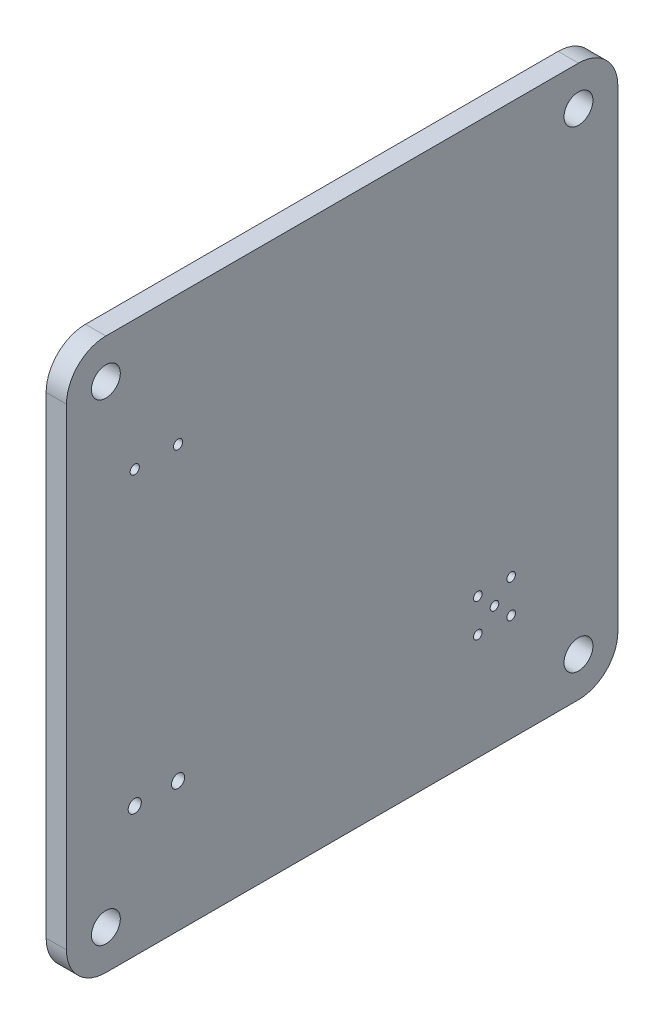
ISO-10303-21;
HEADER;
FILE_DESCRIPTION(('STEP AP214'),'2;1');
FILE_NAME('part.step','',(''),(''),'','','');
FILE_SCHEMA(('AUTOMOTIVE_DESIGN { 1 0 10303 214 1 1 1 1 }'));
ENDSEC;
DATA;
#1=APPLICATION_CONTEXT('core data for automotive mechanical design processes');
#2=APPLICATION_PROTOCOL_DEFINITION('international standard','automotive_design',2000,#1);
#3=PRODUCT_CONTEXT('',#1,'mechanical');
#4=PRODUCT('Part','Part','',(#3));
#5=PRODUCT_RELATED_PRODUCT_CATEGORY('part','',(#4));
#6=PRODUCT_DEFINITION_FORMATION('','',#4);
#7=PRODUCT_DEFINITION_CONTEXT('part definition',#1,'design');
#8=PRODUCT_DEFINITION('design','',#6,#7);
#9=PRODUCT_DEFINITION_SHAPE('','',#8);
#10=(LENGTH_UNIT() NAMED_UNIT(*) SI_UNIT(.MILLI.,.METRE.));
#11=(NAMED_UNIT(*) PLANE_ANGLE_UNIT() SI_UNIT($,.RADIAN.));
#12=(NAMED_UNIT(*) SI_UNIT($,.STERADIAN.) SOLID_ANGLE_UNIT());
#13=UNCERTAINTY_MEASURE_WITH_UNIT(LENGTH_MEASURE(1.E-05),#10,'distance_accuracy_value','');
#14=(GEOMETRIC_REPRESENTATION_CONTEXT(3) GLOBAL_UNCERTAINTY_ASSIGNED_CONTEXT((#13)) GLOBAL_UNIT_ASSIGNED_CONTEXT((#10,
#11,#12)) REPRESENTATION_CONTEXT('',''));
#15=CARTESIAN_POINT('',(0.,0.,0.));
#16=DIRECTION('',(0.,0.,1.));
#17=DIRECTION('',(1.,0.,0.));
#18=AXIS2_PLACEMENT_3D('',#15,#16,#17);
#19=CARTESIAN_POINT('',(0.,21.,21.));
#20=DIRECTION('',(1.,0.,0.));
#21=DIRECTION('',(0.,0.,-1.));
#22=AXIS2_PLACEMENT_3D('',#19,#20,#21);
#23=PLANE('',#22);
#24=CARTESIAN_POINT('',(0.,10.668,8.128));
#25=DIRECTION('',(1.,0.,0.));
#26=DIRECTION('',(0.,0.,-1.));
#27=AXIS2_PLACEMENT_3D('',#24,#25,#26);
#28=CIRCLE('',#27,0.327000000000004);
#29=CARTESIAN_POINT('',(0.,10.668,7.801));
#30=VERTEX_POINT('',#29);
#31=EDGE_CURVE('E165',#30,#30,#28,.T.);
#32=ORIENTED_EDGE('',*,*,#31,.T.);
#33=EDGE_LOOP('',(#32));
#34=FACE_BOUND('',#33,.T.);
#35=CARTESIAN_POINT('',(0.,8.128,8.128));
#36=DIRECTION('',(1.,0.,0.));
#37=DIRECTION('',(0.,0.,-1.));
#38=AXIS2_PLACEMENT_3D('',#35,#36,#37);
#39=CIRCLE('',#38,0.327000000000004);
#40=CARTESIAN_POINT('',(0.,8.128,7.801));
#41=VERTEX_POINT('',#40);
#42=EDGE_CURVE('E168',#41,#41,#39,.T.);
#43=ORIENTED_EDGE('',*,*,#42,.T.);
#44=EDGE_LOOP('',(#43));
#45=FACE_BOUND('',#44,.T.);
#46=CARTESIAN_POINT('',(0.,8.128,10.668));
#47=DIRECTION('',(1.,0.,0.));
#48=DIRECTION('',(0.,0.,-1.));
#49=AXIS2_PLACEMENT_3D('',#46,#47,#48);
#50=CIRCLE('',#49,0.327000000000004);
#51=CARTESIAN_POINT('',(0.,8.128,10.341));
#52=VERTEX_POINT('',#51);
#53=EDGE_CURVE('E171',#52,#52,#50,.T.);
#54=ORIENTED_EDGE('',*,*,#53,.T.);
#55=EDGE_LOOP('',(#54));
#56=FACE_BOUND('',#55,.T.);
#57=CARTESIAN_POINT('',(0.,10.668,10.668));
#58=DIRECTION('',(1.,0.,0.));
#59=DIRECTION('',(0.,0.,-1.));
#60=AXIS2_PLACEMENT_3D('',#57,#58,#59);
#61=CIRCLE('',#60,0.327000000000004);
#62=CARTESIAN_POINT('',(0.,10.668,10.341));
#63=VERTEX_POINT('',#62);
#64=EDGE_CURVE('E174',#63,#63,#61,.T.);
#65=ORIENTED_EDGE('',*,*,#64,.T.);
#66=EDGE_LOOP('',(#65));
#67=FACE_BOUND('',#66,.T.);
#68=CARTESIAN_POINT('',(0.,9.398,9.398));
#69=DIRECTION('',(1.,0.,0.));
#70=DIRECTION('',(0.,0.,-1.));
#71=AXIS2_PLACEMENT_3D('',#68,#69,#70);
#72=CIRCLE('',#71,0.327);
#73=CARTESIAN_POINT('',(0.,9.398,9.071));
#74=VERTEX_POINT('',#73);
#75=EDGE_CURVE('E177',#74,#74,#72,.T.);
#76=ORIENTED_EDGE('',*,*,#75,.T.);
#77=EDGE_LOOP('',(#76));
#78=FACE_BOUND('',#77,.T.);
#79=CARTESIAN_POINT('',(0.,32.1,33.5));
#80=DIRECTION('',(1.,0.,0.));
#81=DIRECTION('',(0.,0.,-1.));
#82=AXIS2_PLACEMENT_3D('',#79,#80,#81);
#83=CIRCLE('',#82,0.35);
#84=CARTESIAN_POINT('',(0.,32.1,33.15));
#85=VERTEX_POINT('',#84);
#86=EDGE_CURVE('E180',#85,#85,#83,.T.);
#87=ORIENTED_EDGE('',*,*,#86,.T.);
#88=EDGE_LOOP('',(#87));
#89=FACE_BOUND('',#88,.T.);
#90=CARTESIAN_POINT('',(0.,32.1,36.8));
#91=DIRECTION('',(1.,0.,0.));
#92=DIRECTION('',(0.,0.,-1.));
#93=AXIS2_PLACEMENT_3D('',#90,#91,#92);
#94=CIRCLE('',#93,0.35);
#95=CARTESIAN_POINT('',(0.,32.1,36.45));
#96=VERTEX_POINT('',#95);
#97=EDGE_CURVE('E183',#96,#96,#94,.T.);
#98=ORIENTED_EDGE('',*,*,#97,.T.);
#99=EDGE_LOOP('',(#98));
#100=FACE_BOUND('',#99,.T.);
#101=CARTESIAN_POINT('',(0.,9.9,33.5));
#102=DIRECTION('',(1.,0.,0.));
#103=DIRECTION('',(0.,0.,-1.));
#104=AXIS2_PLACEMENT_3D('',#101,#102,#103);
#105=CIRCLE('',#104,0.5);
#106=CARTESIAN_POINT('',(0.,9.9,33.));
#107=VERTEX_POINT('',#106);
#108=EDGE_CURVE('E186',#107,#107,#105,.T.);
#109=ORIENTED_EDGE('',*,*,#108,.T.);
#110=EDGE_LOOP('',(#109));
#111=FACE_BOUND('',#110,.T.);
#112=CARTESIAN_POINT('',(0.,9.9,36.8));
#113=DIRECTION('',(1.,0.,0.));
#114=DIRECTION('',(0.,0.,-1.));
#115=AXIS2_PLACEMENT_3D('',#112,#113,#114);
#116=CIRCLE('',#115,0.5);
#117=CARTESIAN_POINT('',(0.,9.9,36.3));
#118=VERTEX_POINT('',#117);
#119=EDGE_CURVE('E189',#118,#118,#116,.T.);
#120=ORIENTED_EDGE('',*,*,#119,.T.);
#121=EDGE_LOOP('',(#120));
#122=FACE_BOUND('',#121,.T.);
#123=CARTESIAN_POINT('',(0.,39.,3.));
#124=DIRECTION('',(1.,0.,0.));
#125=DIRECTION('',(0.,0.,-1.));
#126=AXIS2_PLACEMENT_3D('',#123,#124,#125);
#127=CIRCLE('',#126,1.1);
#128=CARTESIAN_POINT('',(0.,39.,1.9));
#129=VERTEX_POINT('',#128);
#130=EDGE_CURVE('E192',#129,#129,#127,.T.);
#131=ORIENTED_EDGE('',*,*,#130,.T.);
#132=EDGE_LOOP('',(#131));
#133=FACE_BOUND('',#132,.T.);
#134=CARTESIAN_POINT('',(0.,39.,39.));
#135=DIRECTION('',(1.,0.,0.));
#136=DIRECTION('',(0.,0.,-1.));
#137=AXIS2_PLACEMENT_3D('',#134,#135,#136);
#138=CIRCLE('',#137,1.1);
#139=CARTESIAN_POINT('',(0.,39.,37.9));
#140=VERTEX_POINT('',#139);
#141=EDGE_CURVE('E195',#140,#140,#138,.T.);
#142=ORIENTED_EDGE('',*,*,#141,.T.);
#143=EDGE_LOOP('',(#142));
#144=FACE_BOUND('',#143,.T.);
#145=CARTESIAN_POINT('',(0.,3.,3.));
#146=DIRECTION('',(1.,0.,0.));
#147=DIRECTION('',(0.,0.,-1.));
#148=AXIS2_PLACEMENT_3D('',#145,#146,#147);
#149=CIRCLE('',#148,1.1);
#150=CARTESIAN_POINT('',(0.,3.,1.9));
#151=VERTEX_POINT('',#150);
#152=EDGE_CURVE('E198',#151,#151,#149,.T.);
#153=ORIENTED_EDGE('',*,*,#152,.T.);
#154=EDGE_LOOP('',(#153));
#155=FACE_BOUND('',#154,.T.);
#156=CARTESIAN_POINT('',(0.,3.,39.));
#157=DIRECTION('',(1.,0.,0.));
#158=DIRECTION('',(0.,0.,-1.));
#159=AXIS2_PLACEMENT_3D('',#156,#157,#158);
#160=CIRCLE('',#159,1.1);
#161=CARTESIAN_POINT('',(0.,3.,37.9));
#162=VERTEX_POINT('',#161);
#163=EDGE_CURVE('E201',#162,#162,#160,.T.);
#164=ORIENTED_EDGE('',*,*,#163,.T.);
#165=EDGE_LOOP('',(#164));
#166=FACE_BOUND('',#165,.T.);
#167=DIRECTION('',(0.,1.,0.));
#168=VECTOR('',#167,1.);
#169=CARTESIAN_POINT('',(0.,39.,42.));
#170=LINE('',#169,#168);
#171=CARTESIAN_POINT('',(0.,39.,42.));
#172=VERTEX_POINT('',#171);
#173=CARTESIAN_POINT('',(0.,3.,42.));
#174=VERTEX_POINT('',#173);
#175=EDGE_CURVE('E82',#172,#174,#170,.F.);
#176=ORIENTED_EDGE('',*,*,#175,.F.);
#177=CARTESIAN_POINT('',(0.,39.,39.));
#178=DIRECTION('',(1.,0.,0.));
#179=DIRECTION('',(0.,0.,-1.));
#180=AXIS2_PLACEMENT_3D('',#177,#178,#179);
#181=CIRCLE('',#180,3.);
#182=CARTESIAN_POINT('',(0.,42.,39.));
#183=VERTEX_POINT('',#182);
#184=EDGE_CURVE('E99',#183,#172,#181,.T.);
#185=ORIENTED_EDGE('',*,*,#184,.F.);
#186=DIRECTION('',(0.,0.,1.));
#187=VECTOR('',#186,1.);
#188=CARTESIAN_POINT('',(0.,42.,3.));
#189=LINE('',#188,#187);
#190=CARTESIAN_POINT('',(0.,42.,3.));
#191=VERTEX_POINT('',#190);
#192=EDGE_CURVE('E105',#191,#183,#189,.T.);
#193=ORIENTED_EDGE('',*,*,#192,.F.);
#194=CARTESIAN_POINT('',(0.,39.,3.));
#195=DIRECTION('',(1.,0.,0.));
#196=DIRECTION('',(0.,0.,-1.));
#197=AXIS2_PLACEMENT_3D('',#194,#195,#196);
#198=CIRCLE('',#197,3.);
#199=CARTESIAN_POINT('',(0.,39.,0.));
#200=VERTEX_POINT('',#199);
#201=EDGE_CURVE('E205',#200,#191,#198,.T.);
#202=ORIENTED_EDGE('',*,*,#201,.F.);
#203=DIRECTION('',(0.,1.,0.));
#204=VECTOR('',#203,1.);
#205=CARTESIAN_POINT('',(0.,3.,0.));
#206=LINE('',#205,#204);
#207=CARTESIAN_POINT('',(0.,3.,0.));
#208=VERTEX_POINT('',#207);
#209=EDGE_CURVE('E110',#208,#200,#206,.T.);
#210=ORIENTED_EDGE('',*,*,#209,.F.);
#211=CARTESIAN_POINT('',(0.,3.,3.));
#212=DIRECTION('',(1.,0.,0.));
#213=DIRECTION('',(0.,0.,-1.));
#214=AXIS2_PLACEMENT_3D('',#211,#212,#213);
#215=CIRCLE('',#214,3.);
#216=CARTESIAN_POINT('',(0.,0.,3.));
#217=VERTEX_POINT('',#216);
#218=EDGE_CURVE('E207',#217,#208,#215,.T.);
#219=ORIENTED_EDGE('',*,*,#218,.F.);
#220=DIRECTION('',(0.,0.,-1.));
#221=VECTOR('',#220,1.);
#222=CARTESIAN_POINT('',(0.,0.,39.));
#223=LINE('',#222,#221);
#224=CARTESIAN_POINT('',(0.,0.,39.));
#225=VERTEX_POINT('',#224);
#226=EDGE_CURVE('E84',#225,#217,#223,.T.);
#227=ORIENTED_EDGE('',*,*,#226,.F.);
#228=CARTESIAN_POINT('',(0.,3.,39.));
#229=DIRECTION('',(1.,0.,0.));
#230=DIRECTION('',(0.,0.,-1.));
#231=AXIS2_PLACEMENT_3D('',#228,#229,#230);
#232=CIRCLE('',#231,3.);
#233=EDGE_CURVE('E20',#174,#225,#232,.T.);
#234=ORIENTED_EDGE('',*,*,#233,.F.);
#235=EDGE_LOOP('',(#176,#185,#193,#202,#210,#219,#227,#234));
#236=FACE_BOUND('',#235,.T.);
#237=ADVANCED_FACE('F17',(#34,#45,#56,#67,#78,#89,#100,#111,#122,#133,#144,#155,#166,#236),#23,.F.);
#238=CARTESIAN_POINT('',(0.,3.,39.));
#239=DIRECTION('',(1.,0.,0.));
#240=DIRECTION('',(0.,0.,-1.));
#241=AXIS2_PLACEMENT_3D('',#238,#239,#240);
#242=CYLINDRICAL_SURFACE('',#241,3.);
#243=CARTESIAN_POINT('',(1.55,3.,39.));
#244=DIRECTION('',(1.,0.,0.));
#245=DIRECTION('',(0.,0.,-1.));
#246=AXIS2_PLACEMENT_3D('',#243,#244,#245);
#247=CIRCLE('',#246,3.);
#248=CARTESIAN_POINT('',(1.55,3.,42.));
#249=VERTEX_POINT('',#248);
#250=CARTESIAN_POINT('',(1.55,0.,39.));
#251=VERTEX_POINT('',#250);
#252=EDGE_CURVE('E91',#249,#251,#247,.T.);
#253=ORIENTED_EDGE('',*,*,#252,.F.);
#254=DIRECTION('',(1.,0.,0.));
#255=VECTOR('',#254,1.);
#256=CARTESIAN_POINT('',(0.,3.,42.));
#257=LINE('',#256,#255);
#258=EDGE_CURVE('E88',#174,#249,#257,.T.);
#259=ORIENTED_EDGE('',*,*,#258,.F.);
#260=ORIENTED_EDGE('',*,*,#233,.T.);
#261=DIRECTION('',(1.,0.,0.));
#262=VECTOR('',#261,1.);
#263=CARTESIAN_POINT('',(0.,0.,39.));
#264=LINE('',#263,#262);
#265=EDGE_CURVE('E103',#251,#225,#264,.F.);
#266=ORIENTED_EDGE('',*,*,#265,.F.);
#267=EDGE_LOOP('',(#253,#259,#260,#266));
#268=FACE_BOUND('',#267,.T.);
#269=ADVANCED_FACE('F89',(#268),#242,.T.);
#270=CARTESIAN_POINT('',(0.,0.,39.));
#271=DIRECTION('',(0.,-1.,0.));
#272=DIRECTION('',(0.,0.,-1.));
#273=AXIS2_PLACEMENT_3D('',#270,#271,#272);
#274=PLANE('',#273);
#275=DIRECTION('',(0.,0.,-1.));
#276=VECTOR('',#275,1.);
#277=CARTESIAN_POINT('',(1.55,0.,21.));
#278=LINE('',#277,#276);
#279=CARTESIAN_POINT('',(1.55,0.,3.));
#280=VERTEX_POINT('',#279);
#281=EDGE_CURVE('E163',#251,#280,#278,.T.);
#282=ORIENTED_EDGE('',*,*,#281,.F.);
#283=ORIENTED_EDGE('',*,*,#265,.T.);
#284=ORIENTED_EDGE('',*,*,#226,.T.);
#285=DIRECTION('',(1.,0.,0.));
#286=VECTOR('',#285,1.);
#287=CARTESIAN_POINT('',(0.,0.,3.));
#288=LINE('',#287,#286);
#289=EDGE_CURVE('E114',#280,#217,#288,.F.);
#290=ORIENTED_EDGE('',*,*,#289,.F.);
#291=EDGE_LOOP('',(#282,#283,#284,#290));
#292=FACE_BOUND('',#291,.T.);
#293=ADVANCED_FACE('F214',(#292),#274,.T.);
#294=CARTESIAN_POINT('',(0.,3.,3.));
#295=DIRECTION('',(1.,0.,0.));
#296=DIRECTION('',(0.,0.,-1.));
#297=AXIS2_PLACEMENT_3D('',#294,#295,#296);
#298=CYLINDRICAL_SURFACE('',#297,3.);
#299=CARTESIAN_POINT('',(1.55,3.,3.));
#300=DIRECTION('',(1.,0.,0.));
#301=DIRECTION('',(0.,0.,-1.));
#302=AXIS2_PLACEMENT_3D('',#299,#300,#301);
#303=CIRCLE('',#302,3.);
#304=CARTESIAN_POINT('',(1.55,3.,0.));
#305=VERTEX_POINT('',#304);
#306=EDGE_CURVE('E160',#280,#305,#303,.T.);
#307=ORIENTED_EDGE('',*,*,#306,.F.);
#308=ORIENTED_EDGE('',*,*,#289,.T.);
#309=ORIENTED_EDGE('',*,*,#218,.T.);
#310=DIRECTION('',(-1.,0.,0.));
#311=VECTOR('',#310,1.);
#312=CARTESIAN_POINT('',(0.,3.,0.));
#313=LINE('',#312,#311);
#314=EDGE_CURVE('E113',#305,#208,#313,.T.);
#315=ORIENTED_EDGE('',*,*,#314,.F.);
#316=EDGE_LOOP('',(#307,#308,#309,#315));
#317=FACE_BOUND('',#316,.T.);
#318=ADVANCED_FACE('F234',(#317),#298,.T.);
#319=CARTESIAN_POINT('',(0.,3.,0.));
#320=DIRECTION('',(0.,0.,-1.));
#321=DIRECTION('',(-1.,0.,0.));
#322=AXIS2_PLACEMENT_3D('',#319,#320,#321);
#323=PLANE('',#322);
#324=DIRECTION('',(0.,1.,0.));
#325=VECTOR('',#324,1.);
#326=CARTESIAN_POINT('',(1.55,21.,0.));
#327=LINE('',#326,#325);
#328=CARTESIAN_POINT('',(1.55,39.,0.));
#329=VERTEX_POINT('',#328);
#330=EDGE_CURVE('E159',#305,#329,#327,.T.);
#331=ORIENTED_EDGE('',*,*,#330,.F.);
#332=ORIENTED_EDGE('',*,*,#314,.T.);
#333=ORIENTED_EDGE('',*,*,#209,.T.);
#334=DIRECTION('',(1.,0.,0.));
#335=VECTOR('',#334,1.);
#336=CARTESIAN_POINT('',(0.,39.,0.));
#337=LINE('',#336,#335);
#338=EDGE_CURVE('E109',#329,#200,#337,.F.);
#339=ORIENTED_EDGE('',*,*,#338,.F.);
#340=EDGE_LOOP('',(#331,#332,#333,#339));
#341=FACE_BOUND('',#340,.T.);
#342=ADVANCED_FACE('F233',(#341),#323,.T.);
#343=CARTESIAN_POINT('',(0.,39.,3.));
#344=DIRECTION('',(1.,0.,0.));
#345=DIRECTION('',(0.,0.,-1.));
#346=AXIS2_PLACEMENT_3D('',#343,#344,#345);
#347=CYLINDRICAL_SURFACE('',#346,3.);
#348=CARTESIAN_POINT('',(1.55,39.,3.));
#349=DIRECTION('',(1.,0.,0.));
#350=DIRECTION('',(0.,0.,-1.));
#351=AXIS2_PLACEMENT_3D('',#348,#349,#350);
#352=CIRCLE('',#351,3.);
#353=CARTESIAN_POINT('',(1.55,42.,3.));
#354=VERTEX_POINT('',#353);
#355=EDGE_CURVE('E156',#329,#354,#352,.T.);
#356=ORIENTED_EDGE('',*,*,#355,.F.);
#357=ORIENTED_EDGE('',*,*,#338,.T.);
#358=ORIENTED_EDGE('',*,*,#201,.T.);
#359=DIRECTION('',(1.,0.,0.));
#360=VECTOR('',#359,1.);
#361=CARTESIAN_POINT('',(0.,42.,3.));
#362=LINE('',#361,#360);
#363=EDGE_CURVE('E108',#354,#191,#362,.F.);
#364=ORIENTED_EDGE('',*,*,#363,.F.);
#365=EDGE_LOOP('',(#356,#357,#358,#364));
#366=FACE_BOUND('',#365,.T.);
#367=ADVANCED_FACE('F238',(#366),#347,.T.);
#368=CARTESIAN_POINT('',(0.,42.,3.));
#369=DIRECTION('',(0.,1.,0.));
#370=DIRECTION('',(0.,0.,1.));
#371=AXIS2_PLACEMENT_3D('',#368,#369,#370);
#372=PLANE('',#371);
#373=DIRECTION('',(0.,0.,-1.));
#374=VECTOR('',#373,1.);
#375=CARTESIAN_POINT('',(1.55,42.,21.));
#376=LINE('',#375,#374);
#377=CARTESIAN_POINT('',(1.55,42.,39.));
#378=VERTEX_POINT('',#377);
#379=EDGE_CURVE('E155',#354,#378,#376,.F.);
#380=ORIENTED_EDGE('',*,*,#379,.F.);
#381=ORIENTED_EDGE('',*,*,#363,.T.);
#382=ORIENTED_EDGE('',*,*,#192,.T.);
#383=DIRECTION('',(1.,0.,0.));
#384=VECTOR('',#383,1.);
#385=CARTESIAN_POINT('',(0.,42.,39.));
#386=LINE('',#385,#384);
#387=EDGE_CURVE('E96',#378,#183,#386,.F.);
#388=ORIENTED_EDGE('',*,*,#387,.F.);
#389=EDGE_LOOP('',(#380,#381,#382,#388));
#390=FACE_BOUND('',#389,.T.);
#391=ADVANCED_FACE('F240',(#390),#372,.T.);
#392=CARTESIAN_POINT('',(0.,39.,39.));
#393=DIRECTION('',(1.,0.,0.));
#394=DIRECTION('',(0.,0.,-1.));
#395=AXIS2_PLACEMENT_3D('',#392,#393,#394);
#396=CYLINDRICAL_SURFACE('',#395,3.);
#397=CARTESIAN_POINT('',(1.55,39.,39.));
#398=DIRECTION('',(1.,0.,0.));
#399=DIRECTION('',(0.,0.,-1.));
#400=AXIS2_PLACEMENT_3D('',#397,#398,#399);
#401=CIRCLE('',#400,3.);
#402=CARTESIAN_POINT('',(1.55,39.,42.));
#403=VERTEX_POINT('',#402);
#404=EDGE_CURVE('E152',#378,#403,#401,.T.);
#405=ORIENTED_EDGE('',*,*,#404,.F.);
#406=ORIENTED_EDGE('',*,*,#387,.T.);
#407=ORIENTED_EDGE('',*,*,#184,.T.);
#408=DIRECTION('',(1.,0.,0.));
#409=VECTOR('',#408,1.);
#410=CARTESIAN_POINT('',(0.,39.,42.));
#411=LINE('',#410,#409);
#412=EDGE_CURVE('E35',#403,#172,#411,.F.);
#413=ORIENTED_EDGE('',*,*,#412,.F.);
#414=EDGE_LOOP('',(#405,#406,#407,#413));
#415=FACE_BOUND('',#414,.T.);
#416=ADVANCED_FACE('F241',(#415),#396,.T.);
#417=CARTESIAN_POINT('',(0.,39.,42.));
#418=DIRECTION('',(0.,0.,1.));
#419=DIRECTION('',(1.,0.,0.));
#420=AXIS2_PLACEMENT_3D('',#417,#418,#419);
#421=PLANE('',#420);
#422=DIRECTION('',(0.,1.,0.));
#423=VECTOR('',#422,1.);
#424=CARTESIAN_POINT('',(1.55,21.,42.));
#425=LINE('',#424,#423);
#426=EDGE_CURVE('E151',#403,#249,#425,.F.);
#427=ORIENTED_EDGE('',*,*,#426,.F.);
#428=ORIENTED_EDGE('',*,*,#412,.T.);
#429=ORIENTED_EDGE('',*,*,#175,.T.);
#430=ORIENTED_EDGE('',*,*,#258,.T.);
#431=EDGE_LOOP('',(#427,#428,#429,#430));
#432=FACE_BOUND('',#431,.T.);
#433=ADVANCED_FACE('F95',(#432),#421,.T.);
#434=CARTESIAN_POINT('',(0.,3.,39.));
#435=DIRECTION('',(1.,0.,0.));
#436=DIRECTION('',(0.,0.,-1.));
#437=AXIS2_PLACEMENT_3D('',#434,#435,#436);
#438=CYLINDRICAL_SURFACE('',#437,1.1);
#439=ORIENTED_EDGE('',*,*,#163,.F.);
#440=EDGE_LOOP('',(#439));
#441=FACE_BOUND('',#440,.T.);
#442=CARTESIAN_POINT('',(1.55,3.,39.));
#443=DIRECTION('',(1.,0.,0.));
#444=DIRECTION('',(0.,0.,-1.));
#445=AXIS2_PLACEMENT_3D('',#442,#443,#444);
#446=CIRCLE('',#445,1.1);
#447=CARTESIAN_POINT('',(1.55,3.,37.9));
#448=VERTEX_POINT('',#447);
#449=EDGE_CURVE('E148',#448,#448,#446,.F.);
#450=ORIENTED_EDGE('',*,*,#449,.F.);
#451=EDGE_LOOP('',(#450));
#452=FACE_BOUND('',#451,.T.);
#453=ADVANCED_FACE('F249',(#441,#452),#438,.F.);
#454=CARTESIAN_POINT('',(0.,3.,3.));
#455=DIRECTION('',(1.,0.,0.));
#456=DIRECTION('',(0.,0.,-1.));
#457=AXIS2_PLACEMENT_3D('',#454,#455,#456);
#458=CYLINDRICAL_SURFACE('',#457,1.1);
#459=ORIENTED_EDGE('',*,*,#152,.F.);
#460=EDGE_LOOP('',(#459));
#461=FACE_BOUND('',#460,.T.);
#462=CARTESIAN_POINT('',(1.55,3.,3.));
#463=DIRECTION('',(1.,0.,0.));
#464=DIRECTION('',(0.,0.,-1.));
#465=AXIS2_PLACEMENT_3D('',#462,#463,#464);
#466=CIRCLE('',#465,1.1);
#467=CARTESIAN_POINT('',(1.55,3.,1.9));
#468=VERTEX_POINT('',#467);
#469=EDGE_CURVE('E145',#468,#468,#466,.F.);
#470=ORIENTED_EDGE('',*,*,#469,.F.);
#471=EDGE_LOOP('',(#470));
#472=FACE_BOUND('',#471,.T.);
#473=ADVANCED_FACE('F302',(#461,#472),#458,.F.);
#474=CARTESIAN_POINT('',(0.,39.,39.));
#475=DIRECTION('',(1.,0.,0.));
#476=DIRECTION('',(0.,0.,-1.));
#477=AXIS2_PLACEMENT_3D('',#474,#475,#476);
#478=CYLINDRICAL_SURFACE('',#477,1.1);
#479=ORIENTED_EDGE('',*,*,#141,.F.);
#480=EDGE_LOOP('',(#479));
#481=FACE_BOUND('',#480,.T.);
#482=CARTESIAN_POINT('',(1.55,39.,39.));
#483=DIRECTION('',(1.,0.,0.));
#484=DIRECTION('',(0.,0.,-1.));
#485=AXIS2_PLACEMENT_3D('',#482,#483,#484);
#486=CIRCLE('',#485,1.1);
#487=CARTESIAN_POINT('',(1.55,39.,37.9));
#488=VERTEX_POINT('',#487);
#489=EDGE_CURVE('E142',#488,#488,#486,.F.);
#490=ORIENTED_EDGE('',*,*,#489,.F.);
#491=EDGE_LOOP('',(#490));
#492=FACE_BOUND('',#491,.T.);
#493=ADVANCED_FACE('F298',(#481,#492),#478,.F.);
#494=CARTESIAN_POINT('',(0.,39.,3.));
#495=DIRECTION('',(1.,0.,0.));
#496=DIRECTION('',(0.,0.,-1.));
#497=AXIS2_PLACEMENT_3D('',#494,#495,#496);
#498=CYLINDRICAL_SURFACE('',#497,1.1);
#499=ORIENTED_EDGE('',*,*,#130,.F.);
#500=EDGE_LOOP('',(#499));
#501=FACE_BOUND('',#500,.T.);
#502=CARTESIAN_POINT('',(1.55,39.,3.));
#503=DIRECTION('',(1.,0.,0.));
#504=DIRECTION('',(0.,0.,-1.));
#505=AXIS2_PLACEMENT_3D('',#502,#503,#504);
#506=CIRCLE('',#505,1.1);
#507=CARTESIAN_POINT('',(1.55,39.,1.9));
#508=VERTEX_POINT('',#507);
#509=EDGE_CURVE('E139',#508,#508,#506,.F.);
#510=ORIENTED_EDGE('',*,*,#509,.F.);
#511=EDGE_LOOP('',(#510));
#512=FACE_BOUND('',#511,.T.);
#513=ADVANCED_FACE('F294',(#501,#512),#498,.F.);
#514=CARTESIAN_POINT('',(0.,9.9,36.8));
#515=DIRECTION('',(1.,0.,0.));
#516=DIRECTION('',(0.,0.,-1.));
#517=AXIS2_PLACEMENT_3D('',#514,#515,#516);
#518=CYLINDRICAL_SURFACE('',#517,0.5);
#519=ORIENTED_EDGE('',*,*,#119,.F.);
#520=EDGE_LOOP('',(#519));
#521=FACE_BOUND('',#520,.T.);
#522=CARTESIAN_POINT('',(1.55,9.9,36.8));
#523=DIRECTION('',(1.,0.,0.));
#524=DIRECTION('',(0.,0.,-1.));
#525=AXIS2_PLACEMENT_3D('',#522,#523,#524);
#526=CIRCLE('',#525,0.5);
#527=CARTESIAN_POINT('',(1.55,9.9,36.3));
#528=VERTEX_POINT('',#527);
#529=EDGE_CURVE('E136',#528,#528,#526,.F.);
#530=ORIENTED_EDGE('',*,*,#529,.F.);
#531=EDGE_LOOP('',(#530));
#532=FACE_BOUND('',#531,.T.);
#533=ADVANCED_FACE('F290',(#521,#532),#518,.F.);
#534=CARTESIAN_POINT('',(0.,9.9,33.5));
#535=DIRECTION('',(1.,0.,0.));
#536=DIRECTION('',(0.,0.,-1.));
#537=AXIS2_PLACEMENT_3D('',#534,#535,#536);
#538=CYLINDRICAL_SURFACE('',#537,0.5);
#539=ORIENTED_EDGE('',*,*,#108,.F.);
#540=EDGE_LOOP('',(#539));
#541=FACE_BOUND('',#540,.T.);
#542=CARTESIAN_POINT('',(1.55,9.9,33.5));
#543=DIRECTION('',(1.,0.,0.));
#544=DIRECTION('',(0.,0.,-1.));
#545=AXIS2_PLACEMENT_3D('',#542,#543,#544);
#546=CIRCLE('',#545,0.5);
#547=CARTESIAN_POINT('',(1.55,9.9,33.));
#548=VERTEX_POINT('',#547);
#549=EDGE_CURVE('E133',#548,#548,#546,.F.);
#550=ORIENTED_EDGE('',*,*,#549,.F.);
#551=EDGE_LOOP('',(#550));
#552=FACE_BOUND('',#551,.T.);
#553=ADVANCED_FACE('F286',(#541,#552),#538,.F.);
#554=CARTESIAN_POINT('',(0.,32.1,36.8));
#555=DIRECTION('',(1.,0.,0.));
#556=DIRECTION('',(0.,0.,-1.));
#557=AXIS2_PLACEMENT_3D('',#554,#555,#556);
#558=CYLINDRICAL_SURFACE('',#557,0.35);
#559=ORIENTED_EDGE('',*,*,#97,.F.);
#560=EDGE_LOOP('',(#559));
#561=FACE_BOUND('',#560,.T.);
#562=CARTESIAN_POINT('',(1.55,32.1,36.8));
#563=DIRECTION('',(1.,0.,0.));
#564=DIRECTION('',(0.,0.,-1.));
#565=AXIS2_PLACEMENT_3D('',#562,#563,#564);
#566=CIRCLE('',#565,0.35);
#567=CARTESIAN_POINT('',(1.55,32.1,36.45));
#568=VERTEX_POINT('',#567);
#569=EDGE_CURVE('E130',#568,#568,#566,.F.);
#570=ORIENTED_EDGE('',*,*,#569,.F.);
#571=EDGE_LOOP('',(#570));
#572=FACE_BOUND('',#571,.T.);
#573=ADVANCED_FACE('F282',(#561,#572),#558,.F.);
#574=CARTESIAN_POINT('',(0.,32.1,33.5));
#575=DIRECTION('',(1.,0.,0.));
#576=DIRECTION('',(0.,0.,-1.));
#577=AXIS2_PLACEMENT_3D('',#574,#575,#576);
#578=CYLINDRICAL_SURFACE('',#577,0.35);
#579=ORIENTED_EDGE('',*,*,#86,.F.);
#580=EDGE_LOOP('',(#579));
#581=FACE_BOUND('',#580,.T.);
#582=CARTESIAN_POINT('',(1.55,32.1,33.5));
#583=DIRECTION('',(1.,0.,0.));
#584=DIRECTION('',(0.,0.,-1.));
#585=AXIS2_PLACEMENT_3D('',#582,#583,#584);
#586=CIRCLE('',#585,0.35);
#587=CARTESIAN_POINT('',(1.55,32.1,33.15));
#588=VERTEX_POINT('',#587);
#589=EDGE_CURVE('E127',#588,#588,#586,.F.);
#590=ORIENTED_EDGE('',*,*,#589,.F.);
#591=EDGE_LOOP('',(#590));
#592=FACE_BOUND('',#591,.T.);
#593=ADVANCED_FACE('F278',(#581,#592),#578,.F.);
#594=CARTESIAN_POINT('',(0.,9.398,9.398));
#595=DIRECTION('',(1.,0.,0.));
#596=DIRECTION('',(0.,0.,-1.));
#597=AXIS2_PLACEMENT_3D('',#594,#595,#596);
#598=CYLINDRICAL_SURFACE('',#597,0.327);
#599=ORIENTED_EDGE('',*,*,#75,.F.);
#600=EDGE_LOOP('',(#599));
#601=FACE_BOUND('',#600,.T.);
#602=CARTESIAN_POINT('',(1.55,9.398,9.398));
#603=DIRECTION('',(1.,0.,0.));
#604=DIRECTION('',(0.,0.,-1.));
#605=AXIS2_PLACEMENT_3D('',#602,#603,#604);
#606=CIRCLE('',#605,0.327);
#607=CARTESIAN_POINT('',(1.55,9.398,9.071));
#608=VERTEX_POINT('',#607);
#609=EDGE_CURVE('E124',#608,#608,#606,.F.);
#610=ORIENTED_EDGE('',*,*,#609,.F.);
#611=EDGE_LOOP('',(#610));
#612=FACE_BOUND('',#611,.T.);
#613=ADVANCED_FACE('F274',(#601,#612),#598,.F.);
#614=CARTESIAN_POINT('',(0.,10.668,10.668));
#615=DIRECTION('',(1.,0.,0.));
#616=DIRECTION('',(0.,0.,-1.));
#617=AXIS2_PLACEMENT_3D('',#614,#615,#616);
#618=CYLINDRICAL_SURFACE('',#617,0.327000000000004);
#619=ORIENTED_EDGE('',*,*,#64,.F.);
#620=EDGE_LOOP('',(#619));
#621=FACE_BOUND('',#620,.T.);
#622=CARTESIAN_POINT('',(1.55,10.668,10.668));
#623=DIRECTION('',(1.,0.,0.));
#624=DIRECTION('',(0.,0.,-1.));
#625=AXIS2_PLACEMENT_3D('',#622,#623,#624);
#626=CIRCLE('',#625,0.327000000000004);
#627=CARTESIAN_POINT('',(1.55,10.668,10.341));
#628=VERTEX_POINT('',#627);
#629=EDGE_CURVE('E121',#628,#628,#626,.F.);
#630=ORIENTED_EDGE('',*,*,#629,.F.);
#631=EDGE_LOOP('',(#630));
#632=FACE_BOUND('',#631,.T.);
#633=ADVANCED_FACE('F270',(#621,#632),#618,.F.);
#634=CARTESIAN_POINT('',(0.,8.128,10.668));
#635=DIRECTION('',(1.,0.,0.));
#636=DIRECTION('',(0.,0.,-1.));
#637=AXIS2_PLACEMENT_3D('',#634,#635,#636);
#638=CYLINDRICAL_SURFACE('',#637,0.327000000000004);
#639=ORIENTED_EDGE('',*,*,#53,.F.);
#640=EDGE_LOOP('',(#639));
#641=FACE_BOUND('',#640,.T.);
#642=CARTESIAN_POINT('',(1.55,8.128,10.668));
#643=DIRECTION('',(1.,0.,0.));
#644=DIRECTION('',(0.,0.,-1.));
#645=AXIS2_PLACEMENT_3D('',#642,#643,#644);
#646=CIRCLE('',#645,0.327000000000004);
#647=CARTESIAN_POINT('',(1.55,8.128,10.341));
#648=VERTEX_POINT('',#647);
#649=EDGE_CURVE('E118',#648,#648,#646,.F.);
#650=ORIENTED_EDGE('',*,*,#649,.F.);
#651=EDGE_LOOP('',(#650));
#652=FACE_BOUND('',#651,.T.);
#653=ADVANCED_FACE('F266',(#641,#652),#638,.F.);
#654=CARTESIAN_POINT('',(0.,8.128,8.128));
#655=DIRECTION('',(1.,0.,0.));
#656=DIRECTION('',(0.,0.,-1.));
#657=AXIS2_PLACEMENT_3D('',#654,#655,#656);
#658=CYLINDRICAL_SURFACE('',#657,0.327000000000004);
#659=ORIENTED_EDGE('',*,*,#42,.F.);
#660=EDGE_LOOP('',(#659));
#661=FACE_BOUND('',#660,.T.);
#662=CARTESIAN_POINT('',(1.55,8.128,8.128));
#663=DIRECTION('',(1.,0.,0.));
#664=DIRECTION('',(0.,0.,-1.));
#665=AXIS2_PLACEMENT_3D('',#662,#663,#664);
#666=CIRCLE('',#665,0.327000000000004);
#667=CARTESIAN_POINT('',(1.55,8.128,7.801));
#668=VERTEX_POINT('',#667);
#669=EDGE_CURVE('E26',#668,#668,#666,.F.);
#670=ORIENTED_EDGE('',*,*,#669,.F.);
#671=EDGE_LOOP('',(#670));
#672=FACE_BOUND('',#671,.T.);
#673=ADVANCED_FACE('F259',(#661,#672),#658,.F.);
#674=CARTESIAN_POINT('',(0.,10.668,8.128));
#675=DIRECTION('',(1.,0.,0.));
#676=DIRECTION('',(0.,0.,-1.));
#677=AXIS2_PLACEMENT_3D('',#674,#675,#676);
#678=CYLINDRICAL_SURFACE('',#677,0.327000000000004);
#679=ORIENTED_EDGE('',*,*,#31,.F.);
#680=EDGE_LOOP('',(#679));
#681=FACE_BOUND('',#680,.T.);
#682=CARTESIAN_POINT('',(1.55,10.668,8.128));
#683=DIRECTION('',(1.,0.,0.));
#684=DIRECTION('',(0.,0.,-1.));
#685=AXIS2_PLACEMENT_3D('',#682,#683,#684);
#686=CIRCLE('',#685,0.327000000000004);
#687=CARTESIAN_POINT('',(1.55,10.668,7.801));
#688=VERTEX_POINT('',#687);
#689=EDGE_CURVE('E11',#688,#688,#686,.F.);
#690=ORIENTED_EDGE('',*,*,#689,.F.);
#691=EDGE_LOOP('',(#690));
#692=FACE_BOUND('',#691,.T.);
#693=ADVANCED_FACE('F253',(#681,#692),#678,.F.);
#694=CARTESIAN_POINT('',(1.55,21.,21.));
#695=DIRECTION('',(1.,0.,0.));
#696=DIRECTION('',(0.,0.,-1.));
#697=AXIS2_PLACEMENT_3D('',#694,#695,#696);
#698=PLANE('',#697);
#699=ORIENTED_EDGE('',*,*,#689,.T.);
#700=EDGE_LOOP('',(#699));
#701=FACE_BOUND('',#700,.T.);
#702=ORIENTED_EDGE('',*,*,#669,.T.);
#703=EDGE_LOOP('',(#702));
#704=FACE_BOUND('',#703,.T.);
#705=ORIENTED_EDGE('',*,*,#649,.T.);
#706=EDGE_LOOP('',(#705));
#707=FACE_BOUND('',#706,.T.);
#708=ORIENTED_EDGE('',*,*,#629,.T.);
#709=EDGE_LOOP('',(#708));
#710=FACE_BOUND('',#709,.T.);
#711=ORIENTED_EDGE('',*,*,#609,.T.);
#712=EDGE_LOOP('',(#711));
#713=FACE_BOUND('',#712,.T.);
#714=ORIENTED_EDGE('',*,*,#589,.T.);
#715=EDGE_LOOP('',(#714));
#716=FACE_BOUND('',#715,.T.);
#717=ORIENTED_EDGE('',*,*,#569,.T.);
#718=EDGE_LOOP('',(#717));
#719=FACE_BOUND('',#718,.T.);
#720=ORIENTED_EDGE('',*,*,#549,.T.);
#721=EDGE_LOOP('',(#720));
#722=FACE_BOUND('',#721,.T.);
#723=ORIENTED_EDGE('',*,*,#529,.T.);
#724=EDGE_LOOP('',(#723));
#725=FACE_BOUND('',#724,.T.);
#726=ORIENTED_EDGE('',*,*,#509,.T.);
#727=EDGE_LOOP('',(#726));
#728=FACE_BOUND('',#727,.T.);
#729=ORIENTED_EDGE('',*,*,#489,.T.);
#730=EDGE_LOOP('',(#729));
#731=FACE_BOUND('',#730,.T.);
#732=ORIENTED_EDGE('',*,*,#469,.T.);
#733=EDGE_LOOP('',(#732));
#734=FACE_BOUND('',#733,.T.);
#735=ORIENTED_EDGE('',*,*,#449,.T.);
#736=EDGE_LOOP('',(#735));
#737=FACE_BOUND('',#736,.T.);
#738=ORIENTED_EDGE('',*,*,#404,.T.);
#739=ORIENTED_EDGE('',*,*,#426,.T.);
#740=ORIENTED_EDGE('',*,*,#252,.T.);
#741=ORIENTED_EDGE('',*,*,#281,.T.);
#742=ORIENTED_EDGE('',*,*,#306,.T.);
#743=ORIENTED_EDGE('',*,*,#330,.T.);
#744=ORIENTED_EDGE('',*,*,#355,.T.);
#745=ORIENTED_EDGE('',*,*,#379,.T.);
#746=EDGE_LOOP('',(#738,#739,#740,#741,#742,#743,#744,#745));
#747=FACE_BOUND('',#746,.T.);
#748=ADVANCED_FACE('F219',(#701,#704,#707,#710,#713,#716,#719,#722,#725,#728,#731,#734,#737,
#747),#698,.T.);
#749=CLOSED_SHELL('',(#237,#269,#293,#318,#342,#367,#391,#416,#433,#453,#473,#493,#513,#533,
#553,#573,#593,#613,#633,#653,#673,#693,#748));
#750=MANIFOLD_SOLID_BREP('B1',#749);
#751=ADVANCED_BREP_SHAPE_REPRESENTATION('',(#18,#750),#14);
#752=SHAPE_DEFINITION_REPRESENTATION(#9,#751);
ENDSEC;
END-ISO-10303-21;
